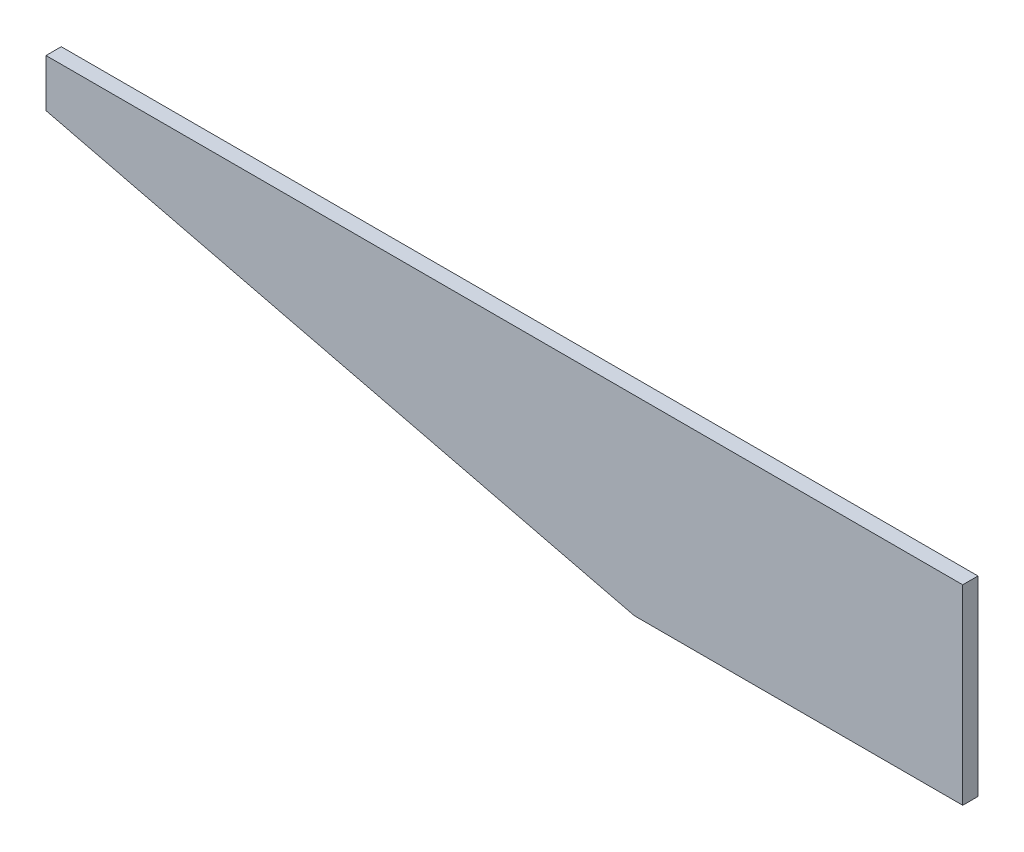
ISO-10303-21;
HEADER;
FILE_DESCRIPTION(('STEP AP214'),'2;1');
FILE_NAME('part.step','',(''),(''),'','','');
FILE_SCHEMA(('AUTOMOTIVE_DESIGN { 1 0 10303 214 1 1 1 1 }'));
ENDSEC;
DATA;
#1=APPLICATION_CONTEXT('core data for automotive mechanical design processes');
#2=APPLICATION_PROTOCOL_DEFINITION('international standard','automotive_design',2000,#1);
#3=PRODUCT_CONTEXT('',#1,'mechanical');
#4=PRODUCT('Part','Part','',(#3));
#5=PRODUCT_RELATED_PRODUCT_CATEGORY('part','',(#4));
#6=PRODUCT_DEFINITION_FORMATION('','',#4);
#7=PRODUCT_DEFINITION_CONTEXT('part definition',#1,'design');
#8=PRODUCT_DEFINITION('design','',#6,#7);
#9=PRODUCT_DEFINITION_SHAPE('','',#8);
#10=(LENGTH_UNIT() NAMED_UNIT(*) SI_UNIT(.MILLI.,.METRE.));
#11=(NAMED_UNIT(*) PLANE_ANGLE_UNIT() SI_UNIT($,.RADIAN.));
#12=(NAMED_UNIT(*) SI_UNIT($,.STERADIAN.) SOLID_ANGLE_UNIT());
#13=UNCERTAINTY_MEASURE_WITH_UNIT(LENGTH_MEASURE(1.E-05),#10,'distance_accuracy_value','');
#14=(GEOMETRIC_REPRESENTATION_CONTEXT(3) GLOBAL_UNCERTAINTY_ASSIGNED_CONTEXT((#13)) GLOBAL_UNIT_ASSIGNED_CONTEXT((#10,
#11,#12)) REPRESENTATION_CONTEXT('',''));
#15=CARTESIAN_POINT('',(0.,0.,0.));
#16=DIRECTION('',(0.,0.,1.));
#17=DIRECTION('',(1.,0.,0.));
#18=AXIS2_PLACEMENT_3D('',#15,#16,#17);
#19=CARTESIAN_POINT('',(-600.,-31.25,-10.));
#20=DIRECTION('',(-1.,0.,0.));
#21=DIRECTION('',(0.,0.,1.));
#22=AXIS2_PLACEMENT_3D('',#19,#20,#21);
#23=PLANE('',#22);
#24=DIRECTION('',(0.,-1.,0.));
#25=VECTOR('',#24,1.);
#26=CARTESIAN_POINT('',(-600.,-31.25,0.));
#27=LINE('',#26,#25);
#28=CARTESIAN_POINT('',(-600.,0.,0.));
#29=VERTEX_POINT('',#28);
#30=CARTESIAN_POINT('',(-600.,-31.25,0.));
#31=VERTEX_POINT('',#30);
#32=EDGE_CURVE('E110',#29,#31,#27,.T.);
#33=ORIENTED_EDGE('',*,*,#32,.F.);
#34=DIRECTION('',(0.,0.,1.));
#35=VECTOR('',#34,1.);
#36=CARTESIAN_POINT('',(-600.,0.,-10.));
#37=LINE('',#36,#35);
#38=CARTESIAN_POINT('',(-600.,0.,-10.));
#39=VERTEX_POINT('',#38);
#40=EDGE_CURVE('E11',#39,#29,#37,.T.);
#41=ORIENTED_EDGE('',*,*,#40,.F.);
#42=DIRECTION('',(0.,-1.,0.));
#43=VECTOR('',#42,1.);
#44=CARTESIAN_POINT('',(-600.,-31.25,-10.));
#45=LINE('',#44,#43);
#46=CARTESIAN_POINT('',(-600.,-31.25,-10.));
#47=VERTEX_POINT('',#46);
#48=EDGE_CURVE('E105',#39,#47,#45,.T.);
#49=ORIENTED_EDGE('',*,*,#48,.T.);
#50=DIRECTION('',(0.,0.,1.));
#51=VECTOR('',#50,1.);
#52=CARTESIAN_POINT('',(-600.,-31.25,-10.));
#53=LINE('',#52,#51);
#54=EDGE_CURVE('E36',#47,#31,#53,.T.);
#55=ORIENTED_EDGE('',*,*,#54,.T.);
#56=EDGE_LOOP('',(#33,#41,#49,#55));
#57=FACE_BOUND('',#56,.T.);
#58=ADVANCED_FACE('F33',(#57),#23,.T.);
#59=CARTESIAN_POINT('',(-600.,0.,-10.));
#60=DIRECTION('',(0.,1.,0.));
#61=DIRECTION('',(0.,0.,1.));
#62=AXIS2_PLACEMENT_3D('',#59,#60,#61);
#63=PLANE('',#62);
#64=DIRECTION('',(-1.,0.,0.));
#65=VECTOR('',#64,1.);
#66=CARTESIAN_POINT('',(-600.,0.,0.));
#67=LINE('',#66,#65);
#68=CARTESIAN_POINT('',(0.,0.,0.));
#69=VERTEX_POINT('',#68);
#70=EDGE_CURVE('E119',#69,#29,#67,.T.);
#71=ORIENTED_EDGE('',*,*,#70,.F.);
#72=DIRECTION('',(0.,0.,1.));
#73=VECTOR('',#72,1.);
#74=CARTESIAN_POINT('',(0.,0.,-10.));
#75=LINE('',#74,#73);
#76=CARTESIAN_POINT('',(0.,0.,-10.));
#77=VERTEX_POINT('',#76);
#78=EDGE_CURVE('E42',#77,#69,#75,.T.);
#79=ORIENTED_EDGE('',*,*,#78,.F.);
#80=DIRECTION('',(-1.,0.,0.));
#81=VECTOR('',#80,1.);
#82=CARTESIAN_POINT('',(-600.,0.,-10.));
#83=LINE('',#82,#81);
#84=EDGE_CURVE('E100',#77,#39,#83,.T.);
#85=ORIENTED_EDGE('',*,*,#84,.T.);
#86=ORIENTED_EDGE('',*,*,#40,.T.);
#87=EDGE_LOOP('',(#71,#79,#85,#86));
#88=FACE_BOUND('',#87,.T.);
#89=ADVANCED_FACE('F125',(#88),#63,.T.);
#90=CARTESIAN_POINT('',(0.,0.,-10.));
#91=DIRECTION('',(1.,0.,0.));
#92=DIRECTION('',(0.,1.,0.));
#93=AXIS2_PLACEMENT_3D('',#90,#91,#92);
#94=PLANE('',#93);
#95=DIRECTION('',(0.,1.,0.));
#96=VECTOR('',#95,1.);
#97=CARTESIAN_POINT('',(0.,0.,0.));
#98=LINE('',#97,#96);
#99=CARTESIAN_POINT('',(0.,-125.,0.));
#100=VERTEX_POINT('',#99);
#101=EDGE_CURVE('E89',#100,#69,#98,.T.);
#102=ORIENTED_EDGE('',*,*,#101,.F.);
#103=DIRECTION('',(0.,0.,1.));
#104=VECTOR('',#103,1.);
#105=CARTESIAN_POINT('',(0.,-125.,-10.));
#106=LINE('',#105,#104);
#107=CARTESIAN_POINT('',(0.,-125.,-10.));
#108=VERTEX_POINT('',#107);
#109=EDGE_CURVE('E84',#108,#100,#106,.T.);
#110=ORIENTED_EDGE('',*,*,#109,.F.);
#111=DIRECTION('',(0.,1.,0.));
#112=VECTOR('',#111,1.);
#113=CARTESIAN_POINT('',(0.,0.,-10.));
#114=LINE('',#113,#112);
#115=EDGE_CURVE('E87',#108,#77,#114,.T.);
#116=ORIENTED_EDGE('',*,*,#115,.T.);
#117=ORIENTED_EDGE('',*,*,#78,.T.);
#118=EDGE_LOOP('',(#102,#110,#116,#117));
#119=FACE_BOUND('',#118,.T.);
#120=ADVANCED_FACE('F86',(#119),#94,.T.);
#121=CARTESIAN_POINT('',(0.,-125.,-10.));
#122=DIRECTION('',(0.,-1.,0.));
#123=DIRECTION('',(1.,0.,0.));
#124=AXIS2_PLACEMENT_3D('',#121,#122,#123);
#125=PLANE('',#124);
#126=DIRECTION('',(1.,0.,0.));
#127=VECTOR('',#126,1.);
#128=CARTESIAN_POINT('',(0.,-125.,0.));
#129=LINE('',#128,#127);
#130=CARTESIAN_POINT('',(-215.,-125.,0.));
#131=VERTEX_POINT('',#130);
#132=EDGE_CURVE('E116',#131,#100,#129,.T.);
#133=ORIENTED_EDGE('',*,*,#132,.F.);
#134=DIRECTION('',(0.,0.,1.));
#135=VECTOR('',#134,1.);
#136=CARTESIAN_POINT('',(-215.,-125.,-10.));
#137=LINE('',#136,#135);
#138=CARTESIAN_POINT('',(-215.,-125.,-10.));
#139=VERTEX_POINT('',#138);
#140=EDGE_CURVE('E94',#139,#131,#137,.T.);
#141=ORIENTED_EDGE('',*,*,#140,.F.);
#142=DIRECTION('',(1.,0.,0.));
#143=VECTOR('',#142,1.);
#144=CARTESIAN_POINT('',(0.,-125.,-10.));
#145=LINE('',#144,#143);
#146=EDGE_CURVE('E99',#139,#108,#145,.T.);
#147=ORIENTED_EDGE('',*,*,#146,.T.);
#148=ORIENTED_EDGE('',*,*,#109,.T.);
#149=EDGE_LOOP('',(#133,#141,#147,#148));
#150=FACE_BOUND('',#149,.T.);
#151=ADVANCED_FACE('F102',(#150),#125,.T.);
#152=CARTESIAN_POINT('',(-215.,-125.,-10.));
#153=DIRECTION('',(-0.236593059936909,-0.971608832807571,0.));
#154=DIRECTION('',(0.971608832807571,-0.236593059936909,0.));
#155=AXIS2_PLACEMENT_3D('',#152,#153,#154);
#156=PLANE('',#155);
#157=DIRECTION('',(0.971608832807571,-0.236593059936909,0.));
#158=VECTOR('',#157,1.);
#159=CARTESIAN_POINT('',(-215.,-125.,0.));
#160=LINE('',#159,#158);
#161=EDGE_CURVE('E113',#31,#131,#160,.T.);
#162=ORIENTED_EDGE('',*,*,#161,.F.);
#163=ORIENTED_EDGE('',*,*,#54,.F.);
#164=DIRECTION('',(0.971608832807571,-0.236593059936909,0.));
#165=VECTOR('',#164,1.);
#166=CARTESIAN_POINT('',(-215.,-125.,-10.));
#167=LINE('',#166,#165);
#168=EDGE_CURVE('E103',#47,#139,#167,.T.);
#169=ORIENTED_EDGE('',*,*,#168,.T.);
#170=ORIENTED_EDGE('',*,*,#140,.T.);
#171=EDGE_LOOP('',(#162,#163,#169,#170));
#172=FACE_BOUND('',#171,.T.);
#173=ADVANCED_FACE('F122',(#172),#156,.T.);
#174=CARTESIAN_POINT('',(0.,0.,-10.));
#175=DIRECTION('',(0.,0.,-1.));
#176=DIRECTION('',(-1.,0.,0.));
#177=AXIS2_PLACEMENT_3D('',#174,#175,#176);
#178=PLANE('',#177);
#179=ORIENTED_EDGE('',*,*,#48,.F.);
#180=ORIENTED_EDGE('',*,*,#84,.F.);
#181=ORIENTED_EDGE('',*,*,#115,.F.);
#182=ORIENTED_EDGE('',*,*,#146,.F.);
#183=ORIENTED_EDGE('',*,*,#168,.F.);
#184=EDGE_LOOP('',(#179,#180,#181,#182,#183));
#185=FACE_BOUND('',#184,.T.);
#186=ADVANCED_FACE('F98',(#185),#178,.T.);
#187=CARTESIAN_POINT('',(0.,0.,0.));
#188=DIRECTION('',(0.,0.,-1.));
#189=DIRECTION('',(-1.,0.,0.));
#190=AXIS2_PLACEMENT_3D('',#187,#188,#189);
#191=PLANE('',#190);
#192=ORIENTED_EDGE('',*,*,#32,.T.);
#193=ORIENTED_EDGE('',*,*,#161,.T.);
#194=ORIENTED_EDGE('',*,*,#132,.T.);
#195=ORIENTED_EDGE('',*,*,#101,.T.);
#196=ORIENTED_EDGE('',*,*,#70,.T.);
#197=EDGE_LOOP('',(#192,#193,#194,#195,#196));
#198=FACE_BOUND('',#197,.T.);
#199=ADVANCED_FACE('F124',(#198),#191,.F.);
#200=CLOSED_SHELL('',(#58,#89,#120,#151,#173,#186,#199));
#201=MANIFOLD_SOLID_BREP('B2',#200);
#202=ADVANCED_BREP_SHAPE_REPRESENTATION('',(#18,#201),#14);
#203=SHAPE_DEFINITION_REPRESENTATION(#9,#202);
ENDSEC;
END-ISO-10303-21;
